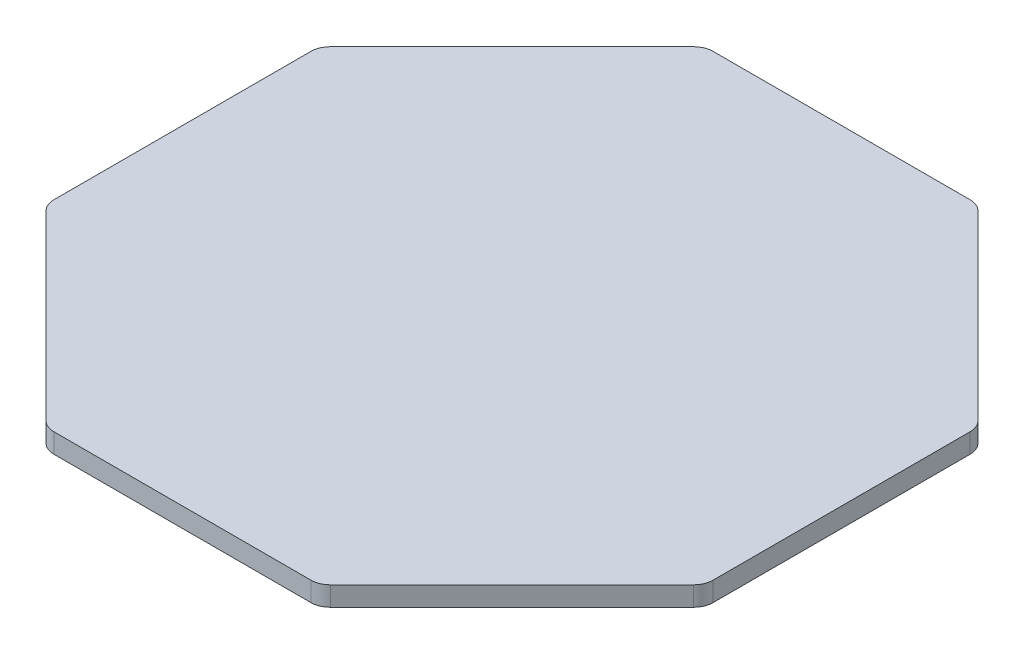
ISO-10303-21;
HEADER;
FILE_DESCRIPTION(('STEP AP214'),'2;1');
FILE_NAME('part.step','',(''),(''),'','','');
FILE_SCHEMA(('AUTOMOTIVE_DESIGN { 1 0 10303 214 1 1 1 1 }'));
ENDSEC;
DATA;
#1=APPLICATION_CONTEXT('core data for automotive mechanical design processes');
#2=APPLICATION_PROTOCOL_DEFINITION('international standard','automotive_design',2000,#1);
#3=PRODUCT_CONTEXT('',#1,'mechanical');
#4=PRODUCT('Part','Part','',(#3));
#5=PRODUCT_RELATED_PRODUCT_CATEGORY('part','',(#4));
#6=PRODUCT_DEFINITION_FORMATION('','',#4);
#7=PRODUCT_DEFINITION_CONTEXT('part definition',#1,'design');
#8=PRODUCT_DEFINITION('design','',#6,#7);
#9=PRODUCT_DEFINITION_SHAPE('','',#8);
#10=(LENGTH_UNIT() NAMED_UNIT(*) SI_UNIT(.MILLI.,.METRE.));
#11=(NAMED_UNIT(*) PLANE_ANGLE_UNIT() SI_UNIT($,.RADIAN.));
#12=(NAMED_UNIT(*) SI_UNIT($,.STERADIAN.) SOLID_ANGLE_UNIT());
#13=UNCERTAINTY_MEASURE_WITH_UNIT(LENGTH_MEASURE(1.E-05),#10,'distance_accuracy_value','');
#14=(GEOMETRIC_REPRESENTATION_CONTEXT(3) GLOBAL_UNCERTAINTY_ASSIGNED_CONTEXT((#13)) GLOBAL_UNIT_ASSIGNED_CONTEXT((#10,
#11,#12)) REPRESENTATION_CONTEXT('',''));
#15=CARTESIAN_POINT('',(0.,0.,0.));
#16=DIRECTION('',(0.,0.,1.));
#17=DIRECTION('',(1.,0.,0.));
#18=AXIS2_PLACEMENT_3D('',#15,#16,#17);
#19=CARTESIAN_POINT('',(-33.7989898732233,2.,-14.));
#20=DIRECTION('',(0.707106781186549,0.,0.707106781186546));
#21=DIRECTION('',(0.707106781186546,0.,-0.707106781186549));
#22=AXIS2_PLACEMENT_3D('',#19,#20,#21);
#23=PLANE('',#22);
#24=DIRECTION('',(-0.707106781186546,0.,0.707106781186549));
#25=VECTOR('',#24,1.);
#26=CARTESIAN_POINT('',(-33.7989898732233,0.,-14.));
#27=LINE('',#26,#25);
#28=CARTESIAN_POINT('',(-14.5857864376269,0.,-33.2132034355965));
#29=VERTEX_POINT('',#28);
#30=CARTESIAN_POINT('',(-33.2132034355964,0.,-14.5857864376269));
#31=VERTEX_POINT('',#30);
#32=EDGE_CURVE('E196',#29,#31,#27,.T.);
#33=ORIENTED_EDGE('',*,*,#32,.T.);
#34=DIRECTION('',(0.,-1.,0.));
#35=VECTOR('',#34,1.);
#36=CARTESIAN_POINT('',(-33.2132034355964,2.,-14.5857864376269));
#37=LINE('',#36,#35);
#38=CARTESIAN_POINT('',(-33.2132034355964,2.,-14.5857864376269));
#39=VERTEX_POINT('',#38);
#40=EDGE_CURVE('E269',#31,#39,#37,.F.);
#41=ORIENTED_EDGE('',*,*,#40,.T.);
#42=DIRECTION('',(-0.707106781186546,0.,0.707106781186549));
#43=VECTOR('',#42,1.);
#44=CARTESIAN_POINT('',(-33.7989898732233,2.,-14.));
#45=LINE('',#44,#43);
#46=CARTESIAN_POINT('',(-14.5857864376269,2.,-33.2132034355965));
#47=VERTEX_POINT('',#46);
#48=EDGE_CURVE('E214',#47,#39,#45,.T.);
#49=ORIENTED_EDGE('',*,*,#48,.F.);
#50=DIRECTION('',(0.,-1.,0.));
#51=VECTOR('',#50,1.);
#52=CARTESIAN_POINT('',(-14.5857864376269,2.,-33.2132034355965));
#53=LINE('',#52,#51);
#54=EDGE_CURVE('E265',#47,#29,#53,.T.);
#55=ORIENTED_EDGE('',*,*,#54,.T.);
#56=EDGE_LOOP('',(#33,#41,#49,#55));
#57=FACE_BOUND('',#56,.T.);
#58=ADVANCED_FACE('F44',(#57),#23,.F.);
#59=CARTESIAN_POINT('',(-33.7989898732233,2.,14.));
#60=DIRECTION('',(1.,0.,0.));
#61=DIRECTION('',(0.,0.,-1.));
#62=AXIS2_PLACEMENT_3D('',#59,#60,#61);
#63=PLANE('',#62);
#64=DIRECTION('',(0.,0.,1.));
#65=VECTOR('',#64,1.);
#66=CARTESIAN_POINT('',(-33.7989898732233,0.,14.));
#67=LINE('',#66,#65);
#68=CARTESIAN_POINT('',(-33.7989898732233,0.,-13.1715728752538));
#69=VERTEX_POINT('',#68);
#70=CARTESIAN_POINT('',(-33.7989898732233,0.,13.1715728752538));
#71=VERTEX_POINT('',#70);
#72=EDGE_CURVE('E189',#69,#71,#67,.T.);
#73=ORIENTED_EDGE('',*,*,#72,.T.);
#74=DIRECTION('',(0.,-1.,0.));
#75=VECTOR('',#74,1.);
#76=CARTESIAN_POINT('',(-33.7989898732233,2.,13.1715728752538));
#77=LINE('',#76,#75);
#78=CARTESIAN_POINT('',(-33.7989898732233,2.,13.1715728752538));
#79=VERTEX_POINT('',#78);
#80=EDGE_CURVE('E164',#71,#79,#77,.F.);
#81=ORIENTED_EDGE('',*,*,#80,.T.);
#82=DIRECTION('',(0.,0.,1.));
#83=VECTOR('',#82,1.);
#84=CARTESIAN_POINT('',(-33.7989898732233,2.,14.));
#85=LINE('',#84,#83);
#86=CARTESIAN_POINT('',(-33.7989898732233,2.,-13.1715728752538));
#87=VERTEX_POINT('',#86);
#88=EDGE_CURVE('E350',#87,#79,#85,.T.);
#89=ORIENTED_EDGE('',*,*,#88,.F.);
#90=DIRECTION('',(0.,-1.,0.));
#91=VECTOR('',#90,1.);
#92=CARTESIAN_POINT('',(-33.7989898732233,2.,-13.1715728752538));
#93=LINE('',#92,#91);
#94=EDGE_CURVE('E170',#87,#69,#93,.T.);
#95=ORIENTED_EDGE('',*,*,#94,.T.);
#96=EDGE_LOOP('',(#73,#81,#89,#95));
#97=FACE_BOUND('',#96,.T.);
#98=ADVANCED_FACE('F352',(#97),#63,.F.);
#99=CARTESIAN_POINT('',(-14.,2.,33.7989898732234));
#100=DIRECTION('',(0.707106781186549,0.,-0.707106781186546));
#101=DIRECTION('',(-0.707106781186546,0.,-0.707106781186549));
#102=AXIS2_PLACEMENT_3D('',#99,#100,#101);
#103=PLANE('',#102);
#104=DIRECTION('',(0.707106781186546,0.,0.707106781186549));
#105=VECTOR('',#104,1.);
#106=CARTESIAN_POINT('',(-14.,2.,33.7989898732234));
#107=LINE('',#106,#105);
#108=CARTESIAN_POINT('',(-33.2132034355964,2.,14.5857864376269));
#109=VERTEX_POINT('',#108);
#110=CARTESIAN_POINT('',(-14.5857864376269,2.,33.2132034355965));
#111=VERTEX_POINT('',#110);
#112=EDGE_CURVE('E180',#109,#111,#107,.T.);
#113=ORIENTED_EDGE('',*,*,#112,.F.);
#114=DIRECTION('',(0.,-1.,0.));
#115=VECTOR('',#114,1.);
#116=CARTESIAN_POINT('',(-33.2132034355964,2.,14.5857864376269));
#117=LINE('',#116,#115);
#118=CARTESIAN_POINT('',(-33.2132034355964,0.,14.5857864376269));
#119=VERTEX_POINT('',#118);
#120=EDGE_CURVE('E163',#109,#119,#117,.T.);
#121=ORIENTED_EDGE('',*,*,#120,.T.);
#122=DIRECTION('',(0.707106781186546,0.,0.707106781186549));
#123=VECTOR('',#122,1.);
#124=CARTESIAN_POINT('',(-14.,0.,33.7989898732234));
#125=LINE('',#124,#123);
#126=CARTESIAN_POINT('',(-14.5857864376269,0.,33.2132034355965));
#127=VERTEX_POINT('',#126);
#128=EDGE_CURVE('E177',#119,#127,#125,.T.);
#129=ORIENTED_EDGE('',*,*,#128,.T.);
#130=DIRECTION('',(0.,-1.,0.));
#131=VECTOR('',#130,1.);
#132=CARTESIAN_POINT('',(-14.5857864376269,2.,33.2132034355965));
#133=LINE('',#132,#131);
#134=EDGE_CURVE('E183',#127,#111,#133,.F.);
#135=ORIENTED_EDGE('',*,*,#134,.T.);
#136=EDGE_LOOP('',(#113,#121,#129,#135));
#137=FACE_BOUND('',#136,.T.);
#138=ADVANCED_FACE('F176',(#137),#103,.F.);
#139=CARTESIAN_POINT('',(14.,2.,33.7989898732234));
#140=DIRECTION('',(0.,0.,-1.));
#141=DIRECTION('',(-1.,0.,0.));
#142=AXIS2_PLACEMENT_3D('',#139,#140,#141);
#143=PLANE('',#142);
#144=DIRECTION('',(1.,0.,0.));
#145=VECTOR('',#144,1.);
#146=CARTESIAN_POINT('',(14.,0.,33.7989898732234));
#147=LINE('',#146,#145);
#148=CARTESIAN_POINT('',(-13.1715728752538,0.,33.7989898732234));
#149=VERTEX_POINT('',#148);
#150=CARTESIAN_POINT('',(13.1715728752538,0.,33.7989898732234));
#151=VERTEX_POINT('',#150);
#152=EDGE_CURVE('E188',#149,#151,#147,.T.);
#153=ORIENTED_EDGE('',*,*,#152,.T.);
#154=DIRECTION('',(0.,-1.,0.));
#155=VECTOR('',#154,1.);
#156=CARTESIAN_POINT('',(13.1715728752538,2.,33.7989898732234));
#157=LINE('',#156,#155);
#158=CARTESIAN_POINT('',(13.1715728752538,2.,33.7989898732234));
#159=VERTEX_POINT('',#158);
#160=EDGE_CURVE('E11',#151,#159,#157,.F.);
#161=ORIENTED_EDGE('',*,*,#160,.T.);
#162=DIRECTION('',(1.,0.,0.));
#163=VECTOR('',#162,1.);
#164=CARTESIAN_POINT('',(14.,2.,33.7989898732234));
#165=LINE('',#164,#163);
#166=CARTESIAN_POINT('',(-13.1715728752538,2.,33.7989898732234));
#167=VERTEX_POINT('',#166);
#168=EDGE_CURVE('E306',#167,#159,#165,.T.);
#169=ORIENTED_EDGE('',*,*,#168,.F.);
#170=DIRECTION('',(0.,-1.,0.));
#171=VECTOR('',#170,1.);
#172=CARTESIAN_POINT('',(-13.1715728752538,2.,33.7989898732234));
#173=LINE('',#172,#171);
#174=EDGE_CURVE('E53',#167,#149,#173,.T.);
#175=ORIENTED_EDGE('',*,*,#174,.T.);
#176=EDGE_LOOP('',(#153,#161,#169,#175));
#177=FACE_BOUND('',#176,.T.);
#178=ADVANCED_FACE('F303',(#177),#143,.F.);
#179=CARTESIAN_POINT('',(33.7989898732233,2.,14.));
#180=DIRECTION('',(-0.707106781186549,0.,-0.707106781186546));
#181=DIRECTION('',(-0.707106781186546,0.,0.707106781186549));
#182=AXIS2_PLACEMENT_3D('',#179,#180,#181);
#183=PLANE('',#182);
#184=DIRECTION('',(0.707106781186546,0.,-0.707106781186549));
#185=VECTOR('',#184,1.);
#186=CARTESIAN_POINT('',(33.7989898732233,0.,14.));
#187=LINE('',#186,#185);
#188=CARTESIAN_POINT('',(14.5857864376269,0.,33.2132034355965));
#189=VERTEX_POINT('',#188);
#190=CARTESIAN_POINT('',(33.2132034355964,0.,14.5857864376269));
#191=VERTEX_POINT('',#190);
#192=EDGE_CURVE('E194',#189,#191,#187,.T.);
#193=ORIENTED_EDGE('',*,*,#192,.T.);
#194=DIRECTION('',(0.,-1.,0.));
#195=VECTOR('',#194,1.);
#196=CARTESIAN_POINT('',(33.2132034355964,2.,14.5857864376269));
#197=LINE('',#196,#195);
#198=CARTESIAN_POINT('',(33.2132034355964,2.,14.5857864376269));
#199=VERTEX_POINT('',#198);
#200=EDGE_CURVE('E296',#191,#199,#197,.F.);
#201=ORIENTED_EDGE('',*,*,#200,.T.);
#202=DIRECTION('',(0.707106781186546,0.,-0.707106781186549));
#203=VECTOR('',#202,1.);
#204=CARTESIAN_POINT('',(33.7989898732233,2.,14.));
#205=LINE('',#204,#203);
#206=CARTESIAN_POINT('',(14.5857864376269,2.,33.2132034355965));
#207=VERTEX_POINT('',#206);
#208=EDGE_CURVE('E319',#207,#199,#205,.T.);
#209=ORIENTED_EDGE('',*,*,#208,.F.);
#210=DIRECTION('',(0.,-1.,0.));
#211=VECTOR('',#210,1.);
#212=CARTESIAN_POINT('',(14.5857864376269,2.,33.2132034355965));
#213=LINE('',#212,#211);
#214=EDGE_CURVE('E292',#207,#189,#213,.T.);
#215=ORIENTED_EDGE('',*,*,#214,.T.);
#216=EDGE_LOOP('',(#193,#201,#209,#215));
#217=FACE_BOUND('',#216,.T.);
#218=ADVANCED_FACE('F316',(#217),#183,.F.);
#219=CARTESIAN_POINT('',(33.7989898732233,2.,-14.));
#220=DIRECTION('',(-1.,0.,0.));
#221=DIRECTION('',(0.,0.,1.));
#222=AXIS2_PLACEMENT_3D('',#219,#220,#221);
#223=PLANE('',#222);
#224=DIRECTION('',(0.,0.,-1.));
#225=VECTOR('',#224,1.);
#226=CARTESIAN_POINT('',(33.7989898732233,0.,-14.));
#227=LINE('',#226,#225);
#228=CARTESIAN_POINT('',(33.7989898732233,0.,13.1715728752538));
#229=VERTEX_POINT('',#228);
#230=CARTESIAN_POINT('',(33.7989898732233,0.,-13.1715728752538));
#231=VERTEX_POINT('',#230);
#232=EDGE_CURVE('E203',#229,#231,#227,.T.);
#233=ORIENTED_EDGE('',*,*,#232,.T.);
#234=DIRECTION('',(0.,-1.,0.));
#235=VECTOR('',#234,1.);
#236=CARTESIAN_POINT('',(33.7989898732233,2.,-13.1715728752538));
#237=LINE('',#236,#235);
#238=CARTESIAN_POINT('',(33.7989898732233,2.,-13.1715728752538));
#239=VERTEX_POINT('',#238);
#240=EDGE_CURVE('E289',#231,#239,#237,.F.);
#241=ORIENTED_EDGE('',*,*,#240,.T.);
#242=DIRECTION('',(0.,0.,-1.));
#243=VECTOR('',#242,1.);
#244=CARTESIAN_POINT('',(33.7989898732233,2.,-14.));
#245=LINE('',#244,#243);
#246=CARTESIAN_POINT('',(33.7989898732233,2.,13.1715728752538));
#247=VERTEX_POINT('',#246);
#248=EDGE_CURVE('E322',#247,#239,#245,.T.);
#249=ORIENTED_EDGE('',*,*,#248,.F.);
#250=DIRECTION('',(0.,-1.,0.));
#251=VECTOR('',#250,1.);
#252=CARTESIAN_POINT('',(33.7989898732233,2.,13.1715728752538));
#253=LINE('',#252,#251);
#254=EDGE_CURVE('E285',#247,#229,#253,.T.);
#255=ORIENTED_EDGE('',*,*,#254,.T.);
#256=EDGE_LOOP('',(#233,#241,#249,#255));
#257=FACE_BOUND('',#256,.T.);
#258=ADVANCED_FACE('F395',(#257),#223,.F.);
#259=CARTESIAN_POINT('',(14.,2.,-33.7989898732234));
#260=DIRECTION('',(-0.707106781186549,0.,0.707106781186546));
#261=DIRECTION('',(0.707106781186546,0.,0.707106781186549));
#262=AXIS2_PLACEMENT_3D('',#259,#260,#261);
#263=PLANE('',#262);
#264=DIRECTION('',(-0.707106781186546,0.,-0.707106781186549));
#265=VECTOR('',#264,1.);
#266=CARTESIAN_POINT('',(14.,0.,-33.7989898732234));
#267=LINE('',#266,#265);
#268=CARTESIAN_POINT('',(33.2132034355964,0.,-14.5857864376269));
#269=VERTEX_POINT('',#268);
#270=CARTESIAN_POINT('',(14.5857864376269,0.,-33.2132034355965));
#271=VERTEX_POINT('',#270);
#272=EDGE_CURVE('E207',#269,#271,#267,.T.);
#273=ORIENTED_EDGE('',*,*,#272,.T.);
#274=DIRECTION('',(0.,-1.,0.));
#275=VECTOR('',#274,1.);
#276=CARTESIAN_POINT('',(14.5857864376269,2.,-33.2132034355965));
#277=LINE('',#276,#275);
#278=CARTESIAN_POINT('',(14.5857864376269,2.,-33.2132034355965));
#279=VERTEX_POINT('',#278);
#280=EDGE_CURVE('E282',#271,#279,#277,.F.);
#281=ORIENTED_EDGE('',*,*,#280,.T.);
#282=DIRECTION('',(-0.707106781186546,0.,-0.707106781186549));
#283=VECTOR('',#282,1.);
#284=CARTESIAN_POINT('',(14.,2.,-33.7989898732234));
#285=LINE('',#284,#283);
#286=CARTESIAN_POINT('',(33.2132034355964,2.,-14.5857864376269));
#287=VERTEX_POINT('',#286);
#288=EDGE_CURVE('E327',#287,#279,#285,.T.);
#289=ORIENTED_EDGE('',*,*,#288,.F.);
#290=DIRECTION('',(0.,-1.,0.));
#291=VECTOR('',#290,1.);
#292=CARTESIAN_POINT('',(33.2132034355964,2.,-14.5857864376269));
#293=LINE('',#292,#291);
#294=EDGE_CURVE('E278',#287,#269,#293,.T.);
#295=ORIENTED_EDGE('',*,*,#294,.T.);
#296=EDGE_LOOP('',(#273,#281,#289,#295));
#297=FACE_BOUND('',#296,.T.);
#298=ADVANCED_FACE('F401',(#297),#263,.F.);
#299=CARTESIAN_POINT('',(-14.,2.,-33.7989898732234));
#300=DIRECTION('',(0.,0.,1.));
#301=DIRECTION('',(1.,0.,0.));
#302=AXIS2_PLACEMENT_3D('',#299,#300,#301);
#303=PLANE('',#302);
#304=DIRECTION('',(-1.,0.,0.));
#305=VECTOR('',#304,1.);
#306=CARTESIAN_POINT('',(-14.,0.,-33.7989898732234));
#307=LINE('',#306,#305);
#308=CARTESIAN_POINT('',(13.1715728752538,0.,-33.7989898732234));
#309=VERTEX_POINT('',#308);
#310=CARTESIAN_POINT('',(-13.1715728752538,0.,-33.7989898732234));
#311=VERTEX_POINT('',#310);
#312=EDGE_CURVE('E211',#309,#311,#307,.T.);
#313=ORIENTED_EDGE('',*,*,#312,.T.);
#314=DIRECTION('',(0.,-1.,0.));
#315=VECTOR('',#314,1.);
#316=CARTESIAN_POINT('',(-13.1715728752538,2.,-33.7989898732234));
#317=LINE('',#316,#315);
#318=CARTESIAN_POINT('',(-13.1715728752538,2.,-33.7989898732234));
#319=VERTEX_POINT('',#318);
#320=EDGE_CURVE('E60',#311,#319,#317,.F.);
#321=ORIENTED_EDGE('',*,*,#320,.T.);
#322=DIRECTION('',(-1.,0.,0.));
#323=VECTOR('',#322,1.);
#324=CARTESIAN_POINT('',(-14.,2.,-33.7989898732234));
#325=LINE('',#324,#323);
#326=CARTESIAN_POINT('',(13.1715728752538,2.,-33.7989898732234));
#327=VERTEX_POINT('',#326);
#328=EDGE_CURVE('E216',#327,#319,#325,.T.);
#329=ORIENTED_EDGE('',*,*,#328,.F.);
#330=DIRECTION('',(0.,-1.,0.));
#331=VECTOR('',#330,1.);
#332=CARTESIAN_POINT('',(13.1715728752538,2.,-33.7989898732234));
#333=LINE('',#332,#331);
#334=EDGE_CURVE('E272',#327,#309,#333,.T.);
#335=ORIENTED_EDGE('',*,*,#334,.T.);
#336=EDGE_LOOP('',(#313,#321,#329,#335));
#337=FACE_BOUND('',#336,.T.);
#338=ADVANCED_FACE('F406',(#337),#303,.F.);
#339=CARTESIAN_POINT('',(0.,2.,0.));
#340=DIRECTION('',(0.,-1.,0.));
#341=DIRECTION('',(0.,0.,-1.));
#342=AXIS2_PLACEMENT_3D('',#339,#340,#341);
#343=PLANE('',#342);
#344=ORIENTED_EDGE('',*,*,#88,.T.);
#345=CARTESIAN_POINT('',(-31.7989898732233,2.,13.1715728752538));
#346=DIRECTION('',(0.,-1.,0.));
#347=DIRECTION('',(0.,0.,-1.));
#348=AXIS2_PLACEMENT_3D('',#345,#346,#347);
#349=CIRCLE('',#348,2.);
#350=EDGE_CURVE('E262',#79,#109,#349,.F.);
#351=ORIENTED_EDGE('',*,*,#350,.T.);
#352=ORIENTED_EDGE('',*,*,#112,.T.);
#353=CARTESIAN_POINT('',(-13.1715728752538,2.,31.7989898732234));
#354=DIRECTION('',(0.,-1.,0.));
#355=DIRECTION('',(0.,0.,-1.));
#356=AXIS2_PLACEMENT_3D('',#353,#354,#355);
#357=CIRCLE('',#356,2.);
#358=EDGE_CURVE('E242',#111,#167,#357,.F.);
#359=ORIENTED_EDGE('',*,*,#358,.T.);
#360=ORIENTED_EDGE('',*,*,#168,.T.);
#361=CARTESIAN_POINT('',(13.1715728752538,2.,31.7989898732234));
#362=DIRECTION('',(0.,-1.,0.));
#363=DIRECTION('',(0.,0.,-1.));
#364=AXIS2_PLACEMENT_3D('',#361,#362,#363);
#365=CIRCLE('',#364,2.);
#366=EDGE_CURVE('E245',#159,#207,#365,.F.);
#367=ORIENTED_EDGE('',*,*,#366,.T.);
#368=ORIENTED_EDGE('',*,*,#208,.T.);
#369=CARTESIAN_POINT('',(31.7989898732233,2.,13.1715728752538));
#370=DIRECTION('',(0.,-1.,0.));
#371=DIRECTION('',(0.,0.,-1.));
#372=AXIS2_PLACEMENT_3D('',#369,#370,#371);
#373=CIRCLE('',#372,2.);
#374=EDGE_CURVE('E248',#199,#247,#373,.F.);
#375=ORIENTED_EDGE('',*,*,#374,.T.);
#376=ORIENTED_EDGE('',*,*,#248,.T.);
#377=CARTESIAN_POINT('',(31.7989898732233,2.,-13.1715728752538));
#378=DIRECTION('',(0.,-1.,0.));
#379=DIRECTION('',(0.,0.,-1.));
#380=AXIS2_PLACEMENT_3D('',#377,#378,#379);
#381=CIRCLE('',#380,2.);
#382=EDGE_CURVE('E251',#239,#287,#381,.F.);
#383=ORIENTED_EDGE('',*,*,#382,.T.);
#384=ORIENTED_EDGE('',*,*,#288,.T.);
#385=CARTESIAN_POINT('',(13.1715728752538,2.,-31.7989898732234));
#386=DIRECTION('',(0.,-1.,0.));
#387=DIRECTION('',(0.,0.,-1.));
#388=AXIS2_PLACEMENT_3D('',#385,#386,#387);
#389=CIRCLE('',#388,2.);
#390=EDGE_CURVE('E67',#279,#327,#389,.F.);
#391=ORIENTED_EDGE('',*,*,#390,.T.);
#392=ORIENTED_EDGE('',*,*,#328,.T.);
#393=CARTESIAN_POINT('',(-13.1715728752538,2.,-31.7989898732234));
#394=DIRECTION('',(0.,-1.,0.));
#395=DIRECTION('',(0.,0.,-1.));
#396=AXIS2_PLACEMENT_3D('',#393,#394,#395);
#397=CIRCLE('',#396,2.);
#398=EDGE_CURVE('E256',#319,#47,#397,.F.);
#399=ORIENTED_EDGE('',*,*,#398,.T.);
#400=ORIENTED_EDGE('',*,*,#48,.T.);
#401=CARTESIAN_POINT('',(-31.7989898732233,2.,-13.1715728752538));
#402=DIRECTION('',(0.,-1.,0.));
#403=DIRECTION('',(0.,0.,-1.));
#404=AXIS2_PLACEMENT_3D('',#401,#402,#403);
#405=CIRCLE('',#404,2.);
#406=EDGE_CURVE('E259',#39,#87,#405,.F.);
#407=ORIENTED_EDGE('',*,*,#406,.T.);
#408=EDGE_LOOP('',(#344,#351,#352,#359,#360,#367,#368,#375,#376,#383,#384,#391,#392,#399,#400,#407));
#409=FACE_BOUND('',#408,.T.);
#410=ADVANCED_FACE('F349',(#409),#343,.F.);
#411=CARTESIAN_POINT('',(0.,0.,0.));
#412=DIRECTION('',(0.,-1.,0.));
#413=DIRECTION('',(0.,0.,-1.));
#414=AXIS2_PLACEMENT_3D('',#411,#412,#413);
#415=PLANE('',#414);
#416=ORIENTED_EDGE('',*,*,#128,.F.);
#417=CARTESIAN_POINT('',(-31.7989898732233,0.,13.1715728752538));
#418=DIRECTION('',(0.,-1.,0.));
#419=DIRECTION('',(0.,0.,-1.));
#420=AXIS2_PLACEMENT_3D('',#417,#418,#419);
#421=CIRCLE('',#420,2.);
#422=EDGE_CURVE('E159',#119,#71,#421,.T.);
#423=ORIENTED_EDGE('',*,*,#422,.T.);
#424=ORIENTED_EDGE('',*,*,#72,.F.);
#425=CARTESIAN_POINT('',(-31.7989898732233,0.,-13.1715728752538));
#426=DIRECTION('',(0.,-1.,0.));
#427=DIRECTION('',(0.,0.,-1.));
#428=AXIS2_PLACEMENT_3D('',#425,#426,#427);
#429=CIRCLE('',#428,2.);
#430=EDGE_CURVE('E171',#69,#31,#429,.T.);
#431=ORIENTED_EDGE('',*,*,#430,.T.);
#432=ORIENTED_EDGE('',*,*,#32,.F.);
#433=CARTESIAN_POINT('',(-13.1715728752538,0.,-31.7989898732234));
#434=DIRECTION('',(0.,-1.,0.));
#435=DIRECTION('',(0.,0.,-1.));
#436=AXIS2_PLACEMENT_3D('',#433,#434,#435);
#437=CIRCLE('',#436,2.);
#438=EDGE_CURVE('E232',#29,#311,#437,.T.);
#439=ORIENTED_EDGE('',*,*,#438,.T.);
#440=ORIENTED_EDGE('',*,*,#312,.F.);
#441=CARTESIAN_POINT('',(13.1715728752538,0.,-31.7989898732234));
#442=DIRECTION('',(0.,-1.,0.));
#443=DIRECTION('',(0.,0.,-1.));
#444=AXIS2_PLACEMENT_3D('',#441,#442,#443);
#445=CIRCLE('',#444,2.);
#446=EDGE_CURVE('E229',#309,#271,#445,.T.);
#447=ORIENTED_EDGE('',*,*,#446,.T.);
#448=ORIENTED_EDGE('',*,*,#272,.F.);
#449=CARTESIAN_POINT('',(31.7989898732233,0.,-13.1715728752538));
#450=DIRECTION('',(0.,-1.,0.));
#451=DIRECTION('',(0.,0.,-1.));
#452=AXIS2_PLACEMENT_3D('',#449,#450,#451);
#453=CIRCLE('',#452,2.);
#454=EDGE_CURVE('E226',#269,#231,#453,.T.);
#455=ORIENTED_EDGE('',*,*,#454,.T.);
#456=ORIENTED_EDGE('',*,*,#232,.F.);
#457=CARTESIAN_POINT('',(31.7989898732233,0.,13.1715728752538));
#458=DIRECTION('',(0.,-1.,0.));
#459=DIRECTION('',(0.,0.,-1.));
#460=AXIS2_PLACEMENT_3D('',#457,#458,#459);
#461=CIRCLE('',#460,2.);
#462=EDGE_CURVE('E223',#229,#191,#461,.T.);
#463=ORIENTED_EDGE('',*,*,#462,.T.);
#464=ORIENTED_EDGE('',*,*,#192,.F.);
#465=CARTESIAN_POINT('',(13.1715728752538,0.,31.7989898732234));
#466=DIRECTION('',(0.,-1.,0.));
#467=DIRECTION('',(0.,0.,-1.));
#468=AXIS2_PLACEMENT_3D('',#465,#466,#467);
#469=CIRCLE('',#468,2.);
#470=EDGE_CURVE('E220',#189,#151,#469,.T.);
#471=ORIENTED_EDGE('',*,*,#470,.T.);
#472=ORIENTED_EDGE('',*,*,#152,.F.);
#473=CARTESIAN_POINT('',(-13.1715728752538,0.,31.7989898732234));
#474=DIRECTION('',(0.,-1.,0.));
#475=DIRECTION('',(0.,0.,-1.));
#476=AXIS2_PLACEMENT_3D('',#473,#474,#475);
#477=CIRCLE('',#476,2.);
#478=EDGE_CURVE('E182',#149,#127,#477,.T.);
#479=ORIENTED_EDGE('',*,*,#478,.T.);
#480=EDGE_LOOP('',(#416,#423,#424,#431,#432,#439,#440,#447,#448,#455,#456,#463,#464,#471,#472,#479));
#481=FACE_BOUND('',#480,.T.);
#482=ADVANCED_FACE('F185',(#481),#415,.T.);
#483=CARTESIAN_POINT('',(-31.7989898732233,2.,13.1715728752538));
#484=DIRECTION('',(0.,-1.,0.));
#485=DIRECTION('',(0.,0.,-1.));
#486=AXIS2_PLACEMENT_3D('',#483,#484,#485);
#487=CYLINDRICAL_SURFACE('',#486,2.);
#488=ORIENTED_EDGE('',*,*,#350,.F.);
#489=ORIENTED_EDGE('',*,*,#80,.F.);
#490=ORIENTED_EDGE('',*,*,#422,.F.);
#491=ORIENTED_EDGE('',*,*,#120,.F.);
#492=EDGE_LOOP('',(#488,#489,#490,#491));
#493=FACE_BOUND('',#492,.T.);
#494=ADVANCED_FACE('F162',(#493),#487,.T.);
#495=CARTESIAN_POINT('',(-31.7989898732233,2.,-13.1715728752538));
#496=DIRECTION('',(0.,-1.,0.));
#497=DIRECTION('',(0.,0.,-1.));
#498=AXIS2_PLACEMENT_3D('',#495,#496,#497);
#499=CYLINDRICAL_SURFACE('',#498,2.);
#500=ORIENTED_EDGE('',*,*,#406,.F.);
#501=ORIENTED_EDGE('',*,*,#40,.F.);
#502=ORIENTED_EDGE('',*,*,#430,.F.);
#503=ORIENTED_EDGE('',*,*,#94,.F.);
#504=EDGE_LOOP('',(#500,#501,#502,#503));
#505=FACE_BOUND('',#504,.T.);
#506=ADVANCED_FACE('F345',(#505),#499,.T.);
#507=CARTESIAN_POINT('',(-13.1715728752538,2.,-31.7989898732234));
#508=DIRECTION('',(0.,-1.,0.));
#509=DIRECTION('',(0.,0.,-1.));
#510=AXIS2_PLACEMENT_3D('',#507,#508,#509);
#511=CYLINDRICAL_SURFACE('',#510,2.);
#512=ORIENTED_EDGE('',*,*,#398,.F.);
#513=ORIENTED_EDGE('',*,*,#320,.F.);
#514=ORIENTED_EDGE('',*,*,#438,.F.);
#515=ORIENTED_EDGE('',*,*,#54,.F.);
#516=EDGE_LOOP('',(#512,#513,#514,#515));
#517=FACE_BOUND('',#516,.T.);
#518=ADVANCED_FACE('F375',(#517),#511,.T.);
#519=CARTESIAN_POINT('',(13.1715728752538,2.,-31.7989898732234));
#520=DIRECTION('',(0.,-1.,0.));
#521=DIRECTION('',(0.,0.,-1.));
#522=AXIS2_PLACEMENT_3D('',#519,#520,#521);
#523=CYLINDRICAL_SURFACE('',#522,2.);
#524=ORIENTED_EDGE('',*,*,#390,.F.);
#525=ORIENTED_EDGE('',*,*,#280,.F.);
#526=ORIENTED_EDGE('',*,*,#446,.F.);
#527=ORIENTED_EDGE('',*,*,#334,.F.);
#528=EDGE_LOOP('',(#524,#525,#526,#527));
#529=FACE_BOUND('',#528,.T.);
#530=ADVANCED_FACE('F378',(#529),#523,.T.);
#531=CARTESIAN_POINT('',(31.7989898732233,2.,-13.1715728752538));
#532=DIRECTION('',(0.,-1.,0.));
#533=DIRECTION('',(0.,0.,-1.));
#534=AXIS2_PLACEMENT_3D('',#531,#532,#533);
#535=CYLINDRICAL_SURFACE('',#534,2.);
#536=ORIENTED_EDGE('',*,*,#382,.F.);
#537=ORIENTED_EDGE('',*,*,#240,.F.);
#538=ORIENTED_EDGE('',*,*,#454,.F.);
#539=ORIENTED_EDGE('',*,*,#294,.F.);
#540=EDGE_LOOP('',(#536,#537,#538,#539));
#541=FACE_BOUND('',#540,.T.);
#542=ADVANCED_FACE('F382',(#541),#535,.T.);
#543=CARTESIAN_POINT('',(31.7989898732233,2.,13.1715728752538));
#544=DIRECTION('',(0.,-1.,0.));
#545=DIRECTION('',(0.,0.,-1.));
#546=AXIS2_PLACEMENT_3D('',#543,#544,#545);
#547=CYLINDRICAL_SURFACE('',#546,2.);
#548=ORIENTED_EDGE('',*,*,#374,.F.);
#549=ORIENTED_EDGE('',*,*,#200,.F.);
#550=ORIENTED_EDGE('',*,*,#462,.F.);
#551=ORIENTED_EDGE('',*,*,#254,.F.);
#552=EDGE_LOOP('',(#548,#549,#550,#551));
#553=FACE_BOUND('',#552,.T.);
#554=ADVANCED_FACE('F362',(#553),#547,.T.);
#555=CARTESIAN_POINT('',(13.1715728752538,2.,31.7989898732234));
#556=DIRECTION('',(0.,-1.,0.));
#557=DIRECTION('',(0.,0.,-1.));
#558=AXIS2_PLACEMENT_3D('',#555,#556,#557);
#559=CYLINDRICAL_SURFACE('',#558,2.);
#560=ORIENTED_EDGE('',*,*,#366,.F.);
#561=ORIENTED_EDGE('',*,*,#160,.F.);
#562=ORIENTED_EDGE('',*,*,#470,.F.);
#563=ORIENTED_EDGE('',*,*,#214,.F.);
#564=EDGE_LOOP('',(#560,#561,#562,#563));
#565=FACE_BOUND('',#564,.T.);
#566=ADVANCED_FACE('F313',(#565),#559,.T.);
#567=CARTESIAN_POINT('',(-13.1715728752538,2.,31.7989898732234));
#568=DIRECTION('',(0.,-1.,0.));
#569=DIRECTION('',(0.,0.,-1.));
#570=AXIS2_PLACEMENT_3D('',#567,#568,#569);
#571=CYLINDRICAL_SURFACE('',#570,2.);
#572=ORIENTED_EDGE('',*,*,#358,.F.);
#573=ORIENTED_EDGE('',*,*,#134,.F.);
#574=ORIENTED_EDGE('',*,*,#478,.F.);
#575=ORIENTED_EDGE('',*,*,#174,.F.);
#576=EDGE_LOOP('',(#572,#573,#574,#575));
#577=FACE_BOUND('',#576,.T.);
#578=ADVANCED_FACE('F46',(#577),#571,.T.);
#579=CLOSED_SHELL('',(#58,#98,#138,#178,#218,#258,#298,#338,#410,#482,#494,#506,#518,#530,#542,
#554,#566,#578));
#580=MANIFOLD_SOLID_BREP('B2',#579);
#581=ADVANCED_BREP_SHAPE_REPRESENTATION('',(#18,#580),#14);
#582=SHAPE_DEFINITION_REPRESENTATION(#9,#581);
ENDSEC;
END-ISO-10303-21;
